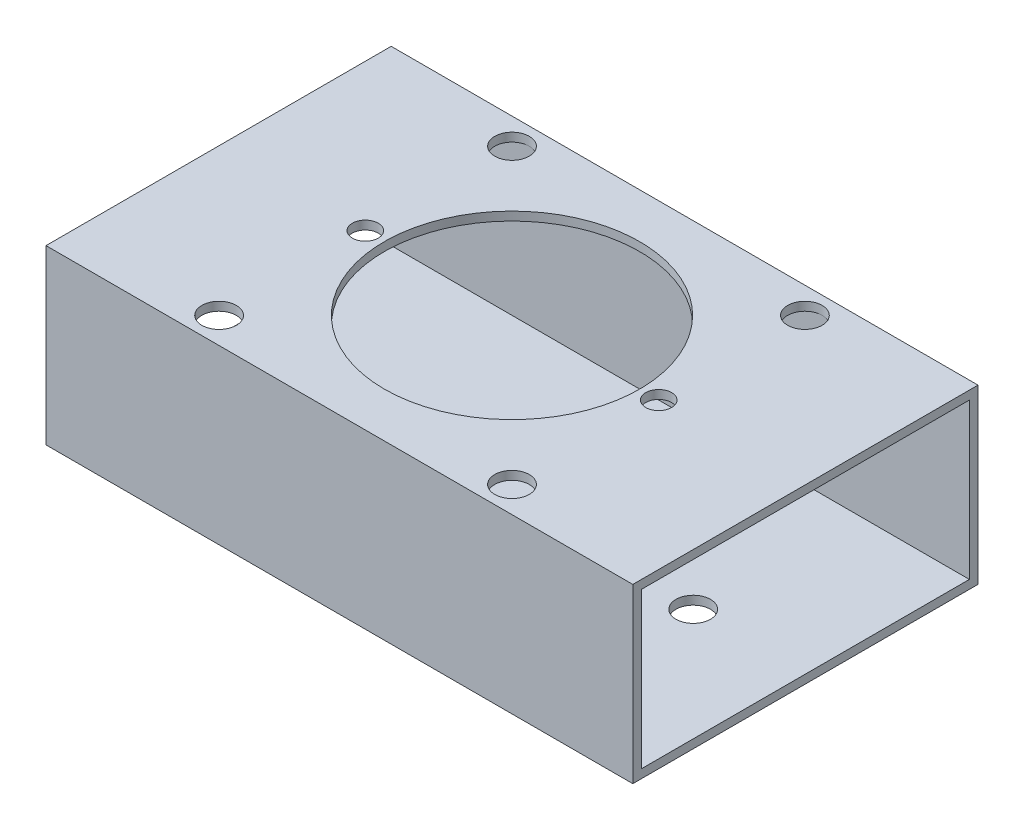
ISO-10303-21;
HEADER;
FILE_DESCRIPTION(('STEP AP214'),'2;1');
FILE_NAME('part.step','',(''),(''),'','','');
FILE_SCHEMA(('AUTOMOTIVE_DESIGN { 1 0 10303 214 1 1 1 1 }'));
ENDSEC;
DATA;
#1=APPLICATION_CONTEXT('core data for automotive mechanical design processes');
#2=APPLICATION_PROTOCOL_DEFINITION('international standard','automotive_design',2000,#1);
#3=PRODUCT_CONTEXT('',#1,'mechanical');
#4=PRODUCT('Part','Part','',(#3));
#5=PRODUCT_RELATED_PRODUCT_CATEGORY('part','',(#4));
#6=PRODUCT_DEFINITION_FORMATION('','',#4);
#7=PRODUCT_DEFINITION_CONTEXT('part definition',#1,'design');
#8=PRODUCT_DEFINITION('design','',#6,#7);
#9=PRODUCT_DEFINITION_SHAPE('','',#8);
#10=(LENGTH_UNIT() NAMED_UNIT(*) SI_UNIT(.MILLI.,.METRE.));
#11=(NAMED_UNIT(*) PLANE_ANGLE_UNIT() SI_UNIT($,.RADIAN.));
#12=(NAMED_UNIT(*) SI_UNIT($,.STERADIAN.) SOLID_ANGLE_UNIT());
#13=UNCERTAINTY_MEASURE_WITH_UNIT(LENGTH_MEASURE(1.E-05),#10,'distance_accuracy_value','');
#14=(GEOMETRIC_REPRESENTATION_CONTEXT(3) GLOBAL_UNCERTAINTY_ASSIGNED_CONTEXT((#13)) GLOBAL_UNIT_ASSIGNED_CONTEXT((#10,
#11,#12)) REPRESENTATION_CONTEXT('',''));
#15=CARTESIAN_POINT('',(0.,0.,0.));
#16=DIRECTION('',(0.,0.,1.));
#17=DIRECTION('',(1.,0.,0.));
#18=AXIS2_PLACEMENT_3D('',#15,#16,#17);
#19=CARTESIAN_POINT('',(-34.,20.,20.));
#20=DIRECTION('',(1.,0.,0.));
#21=DIRECTION('',(0.,0.,-1.));
#22=AXIS2_PLACEMENT_3D('',#19,#20,#21);
#23=PLANE('',#22);
#24=DIRECTION('',(0.,0.,-1.));
#25=VECTOR('',#24,1.);
#26=CARTESIAN_POINT('',(-34.,1.,19.));
#27=LINE('',#26,#25);
#28=CARTESIAN_POINT('',(-34.,1.,19.));
#29=VERTEX_POINT('',#28);
#30=CARTESIAN_POINT('',(-34.,1.,-19.));
#31=VERTEX_POINT('',#30);
#32=EDGE_CURVE('E109',#29,#31,#27,.T.);
#33=ORIENTED_EDGE('',*,*,#32,.T.);
#34=DIRECTION('',(0.,1.,0.));
#35=VECTOR('',#34,1.);
#36=CARTESIAN_POINT('',(-34.,1.,-19.));
#37=LINE('',#36,#35);
#38=CARTESIAN_POINT('',(-34.,19.,-19.));
#39=VERTEX_POINT('',#38);
#40=EDGE_CURVE('E103',#31,#39,#37,.T.);
#41=ORIENTED_EDGE('',*,*,#40,.T.);
#42=DIRECTION('',(0.,0.,1.));
#43=VECTOR('',#42,1.);
#44=CARTESIAN_POINT('',(-34.,19.,-19.));
#45=LINE('',#44,#43);
#46=CARTESIAN_POINT('',(-34.,19.,19.));
#47=VERTEX_POINT('',#46);
#48=EDGE_CURVE('E112',#39,#47,#45,.T.);
#49=ORIENTED_EDGE('',*,*,#48,.T.);
#50=DIRECTION('',(0.,-1.,0.));
#51=VECTOR('',#50,1.);
#52=CARTESIAN_POINT('',(-34.,19.,19.));
#53=LINE('',#52,#51);
#54=EDGE_CURVE('E51',#47,#29,#53,.T.);
#55=ORIENTED_EDGE('',*,*,#54,.T.);
#56=EDGE_LOOP('',(#33,#41,#49,#55));
#57=FACE_BOUND('',#56,.T.);
#58=DIRECTION('',(0.,0.,1.));
#59=VECTOR('',#58,1.);
#60=CARTESIAN_POINT('',(-34.,0.,20.));
#61=LINE('',#60,#59);
#62=CARTESIAN_POINT('',(-34.,0.,-20.));
#63=VERTEX_POINT('',#62);
#64=CARTESIAN_POINT('',(-34.,0.,20.));
#65=VERTEX_POINT('',#64);
#66=EDGE_CURVE('E137',#63,#65,#61,.T.);
#67=ORIENTED_EDGE('',*,*,#66,.T.);
#68=DIRECTION('',(0.,-1.,0.));
#69=VECTOR('',#68,1.);
#70=CARTESIAN_POINT('',(-34.,20.,20.));
#71=LINE('',#70,#69);
#72=CARTESIAN_POINT('',(-34.,20.,20.));
#73=VERTEX_POINT('',#72);
#74=EDGE_CURVE('E11',#73,#65,#71,.T.);
#75=ORIENTED_EDGE('',*,*,#74,.F.);
#76=DIRECTION('',(0.,0.,1.));
#77=VECTOR('',#76,1.);
#78=CARTESIAN_POINT('',(-34.,20.,20.));
#79=LINE('',#78,#77);
#80=CARTESIAN_POINT('',(-34.,20.,-20.));
#81=VERTEX_POINT('',#80);
#82=EDGE_CURVE('E141',#81,#73,#79,.T.);
#83=ORIENTED_EDGE('',*,*,#82,.F.);
#84=DIRECTION('',(0.,-1.,0.));
#85=VECTOR('',#84,1.);
#86=CARTESIAN_POINT('',(-34.,20.,-20.));
#87=LINE('',#86,#85);
#88=EDGE_CURVE('E151',#81,#63,#87,.T.);
#89=ORIENTED_EDGE('',*,*,#88,.T.);
#90=EDGE_LOOP('',(#67,#75,#83,#89));
#91=FACE_BOUND('',#90,.T.);
#92=ADVANCED_FACE('F37',(#57,#91),#23,.F.);
#93=CARTESIAN_POINT('',(-34.,20.,20.));
#94=DIRECTION('',(0.,0.,-1.));
#95=DIRECTION('',(-1.,0.,0.));
#96=AXIS2_PLACEMENT_3D('',#93,#94,#95);
#97=PLANE('',#96);
#98=DIRECTION('',(1.,0.,0.));
#99=VECTOR('',#98,1.);
#100=CARTESIAN_POINT('',(-34.,0.,20.));
#101=LINE('',#100,#99);
#102=CARTESIAN_POINT('',(34.,0.,20.));
#103=VERTEX_POINT('',#102);
#104=EDGE_CURVE('E154',#65,#103,#101,.T.);
#105=ORIENTED_EDGE('',*,*,#104,.T.);
#106=DIRECTION('',(0.,-1.,0.));
#107=VECTOR('',#106,1.);
#108=CARTESIAN_POINT('',(34.,20.,20.));
#109=LINE('',#108,#107);
#110=CARTESIAN_POINT('',(34.,20.,20.));
#111=VERTEX_POINT('',#110);
#112=EDGE_CURVE('E44',#111,#103,#109,.T.);
#113=ORIENTED_EDGE('',*,*,#112,.F.);
#114=DIRECTION('',(1.,0.,0.));
#115=VECTOR('',#114,1.);
#116=CARTESIAN_POINT('',(-34.,20.,20.));
#117=LINE('',#116,#115);
#118=EDGE_CURVE('E144',#73,#111,#117,.T.);
#119=ORIENTED_EDGE('',*,*,#118,.F.);
#120=ORIENTED_EDGE('',*,*,#74,.T.);
#121=EDGE_LOOP('',(#105,#113,#119,#120));
#122=FACE_BOUND('',#121,.T.);
#123=ADVANCED_FACE('F183',(#122),#97,.F.);
#124=CARTESIAN_POINT('',(34.,20.,20.));
#125=DIRECTION('',(-1.,0.,0.));
#126=DIRECTION('',(0.,0.,1.));
#127=AXIS2_PLACEMENT_3D('',#124,#125,#126);
#128=PLANE('',#127);
#129=DIRECTION('',(0.,0.,1.));
#130=VECTOR('',#129,1.);
#131=CARTESIAN_POINT('',(34.,19.,-19.));
#132=LINE('',#131,#130);
#133=CARTESIAN_POINT('',(34.,19.,-19.));
#134=VERTEX_POINT('',#133);
#135=CARTESIAN_POINT('',(34.,19.,19.));
#136=VERTEX_POINT('',#135);
#137=EDGE_CURVE('E130',#134,#136,#132,.T.);
#138=ORIENTED_EDGE('',*,*,#137,.F.);
#139=DIRECTION('',(0.,1.,0.));
#140=VECTOR('',#139,1.);
#141=CARTESIAN_POINT('',(34.,1.,-19.));
#142=LINE('',#141,#140);
#143=CARTESIAN_POINT('',(34.,1.,-19.));
#144=VERTEX_POINT('',#143);
#145=EDGE_CURVE('E59',#144,#134,#142,.T.);
#146=ORIENTED_EDGE('',*,*,#145,.F.);
#147=DIRECTION('',(0.,0.,-1.));
#148=VECTOR('',#147,1.);
#149=CARTESIAN_POINT('',(34.,1.,19.));
#150=LINE('',#149,#148);
#151=CARTESIAN_POINT('',(34.,1.,19.));
#152=VERTEX_POINT('',#151);
#153=EDGE_CURVE('E118',#152,#144,#150,.T.);
#154=ORIENTED_EDGE('',*,*,#153,.F.);
#155=DIRECTION('',(0.,-1.,0.));
#156=VECTOR('',#155,1.);
#157=CARTESIAN_POINT('',(34.,19.,19.));
#158=LINE('',#157,#156);
#159=EDGE_CURVE('E121',#136,#152,#158,.T.);
#160=ORIENTED_EDGE('',*,*,#159,.F.);
#161=EDGE_LOOP('',(#138,#146,#154,#160));
#162=FACE_BOUND('',#161,.T.);
#163=DIRECTION('',(0.,0.,-1.));
#164=VECTOR('',#163,1.);
#165=CARTESIAN_POINT('',(34.,0.,20.));
#166=LINE('',#165,#164);
#167=CARTESIAN_POINT('',(34.,0.,-20.));
#168=VERTEX_POINT('',#167);
#169=EDGE_CURVE('E156',#103,#168,#166,.T.);
#170=ORIENTED_EDGE('',*,*,#169,.T.);
#171=DIRECTION('',(0.,-1.,0.));
#172=VECTOR('',#171,1.);
#173=CARTESIAN_POINT('',(34.,20.,-20.));
#174=LINE('',#173,#172);
#175=CARTESIAN_POINT('',(34.,20.,-20.));
#176=VERTEX_POINT('',#175);
#177=EDGE_CURVE('E161',#176,#168,#174,.T.);
#178=ORIENTED_EDGE('',*,*,#177,.F.);
#179=DIRECTION('',(0.,0.,-1.));
#180=VECTOR('',#179,1.);
#181=CARTESIAN_POINT('',(34.,20.,20.));
#182=LINE('',#181,#180);
#183=EDGE_CURVE('E147',#111,#176,#182,.T.);
#184=ORIENTED_EDGE('',*,*,#183,.F.);
#185=ORIENTED_EDGE('',*,*,#112,.T.);
#186=EDGE_LOOP('',(#170,#178,#184,#185));
#187=FACE_BOUND('',#186,.T.);
#188=ADVANCED_FACE('F168',(#162,#187),#128,.F.);
#189=CARTESIAN_POINT('',(-34.,20.,-20.));
#190=DIRECTION('',(0.,0.,1.));
#191=DIRECTION('',(1.,0.,0.));
#192=AXIS2_PLACEMENT_3D('',#189,#190,#191);
#193=PLANE('',#192);
#194=DIRECTION('',(-1.,0.,0.));
#195=VECTOR('',#194,1.);
#196=CARTESIAN_POINT('',(-34.,0.,-20.));
#197=LINE('',#196,#195);
#198=EDGE_CURVE('E145',#168,#63,#197,.T.);
#199=ORIENTED_EDGE('',*,*,#198,.T.);
#200=ORIENTED_EDGE('',*,*,#88,.F.);
#201=DIRECTION('',(-1.,0.,0.));
#202=VECTOR('',#201,1.);
#203=CARTESIAN_POINT('',(-34.,20.,-20.));
#204=LINE('',#203,#202);
#205=EDGE_CURVE('E149',#176,#81,#204,.T.);
#206=ORIENTED_EDGE('',*,*,#205,.F.);
#207=ORIENTED_EDGE('',*,*,#177,.T.);
#208=EDGE_LOOP('',(#199,#200,#206,#207));
#209=FACE_BOUND('',#208,.T.);
#210=ADVANCED_FACE('F177',(#209),#193,.F.);
#211=CARTESIAN_POINT('',(0.,20.,0.));
#212=DIRECTION('',(0.,-1.,0.));
#213=DIRECTION('',(0.,0.,-1.));
#214=AXIS2_PLACEMENT_3D('',#211,#212,#213);
#215=PLANE('',#214);
#216=CARTESIAN_POINT('',(16.9705627484771,20.,16.9705627484771));
#217=DIRECTION('',(0.,1.,0.));
#218=DIRECTION('',(0.,0.,1.));
#219=AXIS2_PLACEMENT_3D('',#216,#217,#218);
#220=CIRCLE('',#219,1.99999999999999);
#221=CARTESIAN_POINT('',(16.9705627484771,20.,18.9705627484771));
#222=VERTEX_POINT('',#221);
#223=EDGE_CURVE('E255',#222,#222,#220,.T.);
#224=ORIENTED_EDGE('',*,*,#223,.F.);
#225=EDGE_LOOP('',(#224));
#226=FACE_BOUND('',#225,.T.);
#227=CARTESIAN_POINT('',(-16.9705627484771,20.,16.9705627484771));
#228=DIRECTION('',(0.,1.,0.));
#229=DIRECTION('',(0.,0.,1.));
#230=AXIS2_PLACEMENT_3D('',#227,#228,#229);
#231=CIRCLE('',#230,1.99999999999999);
#232=CARTESIAN_POINT('',(-16.9705627484771,20.,18.9705627484771));
#233=VERTEX_POINT('',#232);
#234=EDGE_CURVE('E257',#233,#233,#231,.T.);
#235=ORIENTED_EDGE('',*,*,#234,.F.);
#236=EDGE_LOOP('',(#235));
#237=FACE_BOUND('',#236,.T.);
#238=CARTESIAN_POINT('',(-16.9705627484771,20.,-16.9705627484771));
#239=DIRECTION('',(0.,1.,0.));
#240=DIRECTION('',(0.,0.,1.));
#241=AXIS2_PLACEMENT_3D('',#238,#239,#240);
#242=CIRCLE('',#241,1.99999999999999);
#243=CARTESIAN_POINT('',(-16.9705627484771,20.,-14.9705627484771));
#244=VERTEX_POINT('',#243);
#245=EDGE_CURVE('E265',#244,#244,#242,.T.);
#246=ORIENTED_EDGE('',*,*,#245,.F.);
#247=EDGE_LOOP('',(#246));
#248=FACE_BOUND('',#247,.T.);
#249=CARTESIAN_POINT('',(16.9705627484771,20.,-16.9705627484771));
#250=DIRECTION('',(0.,1.,0.));
#251=DIRECTION('',(0.,0.,1.));
#252=AXIS2_PLACEMENT_3D('',#249,#250,#251);
#253=CIRCLE('',#252,1.99999999999999);
#254=CARTESIAN_POINT('',(16.9705627484771,20.,-14.9705627484771));
#255=VERTEX_POINT('',#254);
#256=EDGE_CURVE('E271',#255,#255,#253,.T.);
#257=ORIENTED_EDGE('',*,*,#256,.F.);
#258=EDGE_LOOP('',(#257));
#259=FACE_BOUND('',#258,.T.);
#260=CARTESIAN_POINT('',(17.,20.,0.));
#261=DIRECTION('',(0.,1.,0.));
#262=DIRECTION('',(0.,0.,1.));
#263=AXIS2_PLACEMENT_3D('',#260,#261,#262);
#264=CIRCLE('',#263,1.5);
#265=CARTESIAN_POINT('',(17.,20.,1.5));
#266=VERTEX_POINT('',#265);
#267=EDGE_CURVE('E285',#266,#266,#264,.T.);
#268=ORIENTED_EDGE('',*,*,#267,.F.);
#269=EDGE_LOOP('',(#268));
#270=FACE_BOUND('',#269,.T.);
#271=CARTESIAN_POINT('',(-17.,20.,0.));
#272=DIRECTION('',(0.,1.,0.));
#273=DIRECTION('',(0.,0.,1.));
#274=AXIS2_PLACEMENT_3D('',#271,#272,#273);
#275=CIRCLE('',#274,1.5);
#276=CARTESIAN_POINT('',(-17.,20.,1.5));
#277=VERTEX_POINT('',#276);
#278=EDGE_CURVE('E278',#277,#277,#275,.T.);
#279=ORIENTED_EDGE('',*,*,#278,.F.);
#280=EDGE_LOOP('',(#279));
#281=FACE_BOUND('',#280,.T.);
#282=CARTESIAN_POINT('',(0.,20.,0.));
#283=DIRECTION('',(0.,1.,0.));
#284=DIRECTION('',(0.,0.,1.));
#285=AXIS2_PLACEMENT_3D('',#282,#283,#284);
#286=CIRCLE('',#285,14.8);
#287=CARTESIAN_POINT('',(0.,20.,14.8));
#288=VERTEX_POINT('',#287);
#289=EDGE_CURVE('E281',#288,#288,#286,.T.);
#290=ORIENTED_EDGE('',*,*,#289,.F.);
#291=EDGE_LOOP('',(#290));
#292=FACE_BOUND('',#291,.T.);
#293=ORIENTED_EDGE('',*,*,#82,.T.);
#294=ORIENTED_EDGE('',*,*,#118,.T.);
#295=ORIENTED_EDGE('',*,*,#183,.T.);
#296=ORIENTED_EDGE('',*,*,#205,.T.);
#297=EDGE_LOOP('',(#293,#294,#295,#296));
#298=FACE_BOUND('',#297,.T.);
#299=ADVANCED_FACE('F182',(#226,#237,#248,#259,#270,#281,#292,#298),#215,.F.);
#300=CARTESIAN_POINT('',(0.,0.,0.));
#301=DIRECTION('',(0.,-1.,0.));
#302=DIRECTION('',(0.,0.,-1.));
#303=AXIS2_PLACEMENT_3D('',#300,#301,#302);
#304=PLANE('',#303);
#305=CARTESIAN_POINT('',(-21.,0.,0.));
#306=DIRECTION('',(0.,-1.,0.));
#307=DIRECTION('',(0.,0.,-1.));
#308=AXIS2_PLACEMENT_3D('',#305,#306,#307);
#309=CIRCLE('',#308,2.);
#310=CARTESIAN_POINT('',(-21.,0.,-2.));
#311=VERTEX_POINT('',#310);
#312=EDGE_CURVE('E297',#311,#311,#309,.T.);
#313=ORIENTED_EDGE('',*,*,#312,.F.);
#314=EDGE_LOOP('',(#313));
#315=FACE_BOUND('',#314,.T.);
#316=CARTESIAN_POINT('',(21.,0.,0.));
#317=DIRECTION('',(0.,-1.,0.));
#318=DIRECTION('',(0.,0.,-1.));
#319=AXIS2_PLACEMENT_3D('',#316,#317,#318);
#320=CIRCLE('',#319,2.);
#321=CARTESIAN_POINT('',(21.,0.,-2.));
#322=VERTEX_POINT('',#321);
#323=EDGE_CURVE('E299',#322,#322,#320,.T.);
#324=ORIENTED_EDGE('',*,*,#323,.F.);
#325=EDGE_LOOP('',(#324));
#326=FACE_BOUND('',#325,.T.);
#327=ORIENTED_EDGE('',*,*,#66,.F.);
#328=ORIENTED_EDGE('',*,*,#198,.F.);
#329=ORIENTED_EDGE('',*,*,#169,.F.);
#330=ORIENTED_EDGE('',*,*,#104,.F.);
#331=EDGE_LOOP('',(#327,#328,#329,#330));
#332=FACE_BOUND('',#331,.T.);
#333=ADVANCED_FACE('F174',(#315,#326,#332),#304,.T.);
#334=CARTESIAN_POINT('',(-34.,1.,-19.));
#335=DIRECTION('',(0.,0.,-1.));
#336=DIRECTION('',(-1.,0.,0.));
#337=AXIS2_PLACEMENT_3D('',#334,#335,#336);
#338=PLANE('',#337);
#339=ORIENTED_EDGE('',*,*,#145,.T.);
#340=DIRECTION('',(1.,0.,0.));
#341=VECTOR('',#340,1.);
#342=CARTESIAN_POINT('',(-34.,19.,-19.));
#343=LINE('',#342,#341);
#344=EDGE_CURVE('E99',#39,#134,#343,.T.);
#345=ORIENTED_EDGE('',*,*,#344,.F.);
#346=ORIENTED_EDGE('',*,*,#40,.F.);
#347=DIRECTION('',(1.,0.,0.));
#348=VECTOR('',#347,1.);
#349=CARTESIAN_POINT('',(-34.,1.,-19.));
#350=LINE('',#349,#348);
#351=EDGE_CURVE('E135',#31,#144,#350,.T.);
#352=ORIENTED_EDGE('',*,*,#351,.T.);
#353=EDGE_LOOP('',(#339,#345,#346,#352));
#354=FACE_BOUND('',#353,.T.);
#355=ADVANCED_FACE('F101',(#354),#338,.F.);
#356=CARTESIAN_POINT('',(-34.,1.,19.));
#357=DIRECTION('',(0.,-1.,0.));
#358=DIRECTION('',(0.,0.,-1.));
#359=AXIS2_PLACEMENT_3D('',#356,#357,#358);
#360=PLANE('',#359);
#361=CARTESIAN_POINT('',(-21.,1.,0.));
#362=DIRECTION('',(0.,-1.,0.));
#363=DIRECTION('',(0.,0.,-1.));
#364=AXIS2_PLACEMENT_3D('',#361,#362,#363);
#365=CIRCLE('',#364,2.);
#366=CARTESIAN_POINT('',(-21.,1.,-2.));
#367=VERTEX_POINT('',#366);
#368=EDGE_CURVE('E131',#367,#367,#365,.T.);
#369=ORIENTED_EDGE('',*,*,#368,.T.);
#370=EDGE_LOOP('',(#369));
#371=FACE_BOUND('',#370,.T.);
#372=CARTESIAN_POINT('',(21.,1.,0.));
#373=DIRECTION('',(0.,-1.,0.));
#374=DIRECTION('',(0.,0.,-1.));
#375=AXIS2_PLACEMENT_3D('',#372,#373,#374);
#376=CIRCLE('',#375,2.);
#377=CARTESIAN_POINT('',(21.,1.,-2.));
#378=VERTEX_POINT('',#377);
#379=EDGE_CURVE('E124',#378,#378,#376,.T.);
#380=ORIENTED_EDGE('',*,*,#379,.T.);
#381=EDGE_LOOP('',(#380));
#382=FACE_BOUND('',#381,.T.);
#383=ORIENTED_EDGE('',*,*,#153,.T.);
#384=ORIENTED_EDGE('',*,*,#351,.F.);
#385=ORIENTED_EDGE('',*,*,#32,.F.);
#386=DIRECTION('',(1.,0.,0.));
#387=VECTOR('',#386,1.);
#388=CARTESIAN_POINT('',(-34.,1.,19.));
#389=LINE('',#388,#387);
#390=EDGE_CURVE('E138',#29,#152,#389,.T.);
#391=ORIENTED_EDGE('',*,*,#390,.T.);
#392=EDGE_LOOP('',(#383,#384,#385,#391));
#393=FACE_BOUND('',#392,.T.);
#394=ADVANCED_FACE('F202',(#371,#382,#393),#360,.F.);
#395=CARTESIAN_POINT('',(-34.,19.,19.));
#396=DIRECTION('',(0.,0.,1.));
#397=DIRECTION('',(1.,0.,0.));
#398=AXIS2_PLACEMENT_3D('',#395,#396,#397);
#399=PLANE('',#398);
#400=ORIENTED_EDGE('',*,*,#159,.T.);
#401=ORIENTED_EDGE('',*,*,#390,.F.);
#402=ORIENTED_EDGE('',*,*,#54,.F.);
#403=DIRECTION('',(1.,0.,0.));
#404=VECTOR('',#403,1.);
#405=CARTESIAN_POINT('',(-34.,19.,19.));
#406=LINE('',#405,#404);
#407=EDGE_CURVE('E108',#47,#136,#406,.T.);
#408=ORIENTED_EDGE('',*,*,#407,.T.);
#409=EDGE_LOOP('',(#400,#401,#402,#408));
#410=FACE_BOUND('',#409,.T.);
#411=ADVANCED_FACE('F206',(#410),#399,.F.);
#412=CARTESIAN_POINT('',(-34.,19.,-19.));
#413=DIRECTION('',(0.,1.,0.));
#414=DIRECTION('',(0.,0.,1.));
#415=AXIS2_PLACEMENT_3D('',#412,#413,#414);
#416=PLANE('',#415);
#417=CARTESIAN_POINT('',(16.9705627484771,19.,16.9705627484771));
#418=DIRECTION('',(0.,1.,0.));
#419=DIRECTION('',(0.,0.,1.));
#420=AXIS2_PLACEMENT_3D('',#417,#418,#419);
#421=CIRCLE('',#420,2.);
#422=CARTESIAN_POINT('',(16.9705627484771,19.,18.9705627484771));
#423=VERTEX_POINT('',#422);
#424=EDGE_CURVE('E252',#423,#423,#421,.T.);
#425=ORIENTED_EDGE('',*,*,#424,.T.);
#426=EDGE_LOOP('',(#425));
#427=FACE_BOUND('',#426,.T.);
#428=CARTESIAN_POINT('',(-16.9705627484771,19.,16.9705627484771));
#429=DIRECTION('',(0.,1.,0.));
#430=DIRECTION('',(0.,0.,1.));
#431=AXIS2_PLACEMENT_3D('',#428,#429,#430);
#432=CIRCLE('',#431,2.);
#433=CARTESIAN_POINT('',(-16.9705627484771,19.,18.9705627484772));
#434=VERTEX_POINT('',#433);
#435=EDGE_CURVE('E262',#434,#434,#432,.T.);
#436=ORIENTED_EDGE('',*,*,#435,.T.);
#437=EDGE_LOOP('',(#436));
#438=FACE_BOUND('',#437,.T.);
#439=CARTESIAN_POINT('',(-16.9705627484771,19.,-16.9705627484771));
#440=DIRECTION('',(0.,1.,0.));
#441=DIRECTION('',(0.,0.,1.));
#442=AXIS2_PLACEMENT_3D('',#439,#440,#441);
#443=CIRCLE('',#442,2.);
#444=CARTESIAN_POINT('',(-16.9705627484771,19.,-14.9705627484771));
#445=VERTEX_POINT('',#444);
#446=EDGE_CURVE('E268',#445,#445,#443,.T.);
#447=ORIENTED_EDGE('',*,*,#446,.T.);
#448=EDGE_LOOP('',(#447));
#449=FACE_BOUND('',#448,.T.);
#450=CARTESIAN_POINT('',(16.9705627484771,19.,-16.9705627484771));
#451=DIRECTION('',(0.,1.,0.));
#452=DIRECTION('',(0.,0.,1.));
#453=AXIS2_PLACEMENT_3D('',#450,#451,#452);
#454=CIRCLE('',#453,2.);
#455=CARTESIAN_POINT('',(16.9705627484771,19.,-14.9705627484771));
#456=VERTEX_POINT('',#455);
#457=EDGE_CURVE('E274',#456,#456,#454,.T.);
#458=ORIENTED_EDGE('',*,*,#457,.T.);
#459=EDGE_LOOP('',(#458));
#460=FACE_BOUND('',#459,.T.);
#461=CARTESIAN_POINT('',(17.,19.,0.));
#462=DIRECTION('',(0.,1.,0.));
#463=DIRECTION('',(0.,0.,1.));
#464=AXIS2_PLACEMENT_3D('',#461,#462,#463);
#465=CIRCLE('',#464,1.5);
#466=CARTESIAN_POINT('',(17.,19.,1.5));
#467=VERTEX_POINT('',#466);
#468=EDGE_CURVE('E277',#467,#467,#465,.T.);
#469=ORIENTED_EDGE('',*,*,#468,.T.);
#470=EDGE_LOOP('',(#469));
#471=FACE_BOUND('',#470,.T.);
#472=CARTESIAN_POINT('',(-17.,19.,0.));
#473=DIRECTION('',(0.,1.,0.));
#474=DIRECTION('',(0.,0.,1.));
#475=AXIS2_PLACEMENT_3D('',#472,#473,#474);
#476=CIRCLE('',#475,1.5);
#477=CARTESIAN_POINT('',(-17.,19.,1.5));
#478=VERTEX_POINT('',#477);
#479=EDGE_CURVE('E282',#478,#478,#476,.T.);
#480=ORIENTED_EDGE('',*,*,#479,.T.);
#481=EDGE_LOOP('',(#480));
#482=FACE_BOUND('',#481,.T.);
#483=CARTESIAN_POINT('',(0.,19.,0.));
#484=DIRECTION('',(0.,1.,0.));
#485=DIRECTION('',(0.,0.,1.));
#486=AXIS2_PLACEMENT_3D('',#483,#484,#485);
#487=CIRCLE('',#486,14.8);
#488=CARTESIAN_POINT('',(0.,19.,14.8));
#489=VERTEX_POINT('',#488);
#490=EDGE_CURVE('E290',#489,#489,#487,.T.);
#491=ORIENTED_EDGE('',*,*,#490,.T.);
#492=EDGE_LOOP('',(#491));
#493=FACE_BOUND('',#492,.T.);
#494=ORIENTED_EDGE('',*,*,#137,.T.);
#495=ORIENTED_EDGE('',*,*,#407,.F.);
#496=ORIENTED_EDGE('',*,*,#48,.F.);
#497=ORIENTED_EDGE('',*,*,#344,.T.);
#498=EDGE_LOOP('',(#494,#495,#496,#497));
#499=FACE_BOUND('',#498,.T.);
#500=ADVANCED_FACE('F113',(#427,#438,#449,#460,#471,#482,#493,#499),#416,.F.);
#501=CARTESIAN_POINT('',(21.,1.,0.));
#502=DIRECTION('',(0.,-1.,0.));
#503=DIRECTION('',(0.,0.,-1.));
#504=AXIS2_PLACEMENT_3D('',#501,#502,#503);
#505=CYLINDRICAL_SURFACE('',#504,2.);
#506=ORIENTED_EDGE('',*,*,#379,.F.);
#507=EDGE_LOOP('',(#506));
#508=FACE_BOUND('',#507,.T.);
#509=ORIENTED_EDGE('',*,*,#323,.T.);
#510=EDGE_LOOP('',(#509));
#511=FACE_BOUND('',#510,.T.);
#512=ADVANCED_FACE('F205',(#508,#511),#505,.F.);
#513=CARTESIAN_POINT('',(-21.,1.,0.));
#514=DIRECTION('',(0.,-1.,0.));
#515=DIRECTION('',(0.,0.,-1.));
#516=AXIS2_PLACEMENT_3D('',#513,#514,#515);
#517=CYLINDRICAL_SURFACE('',#516,2.);
#518=ORIENTED_EDGE('',*,*,#368,.F.);
#519=EDGE_LOOP('',(#518));
#520=FACE_BOUND('',#519,.T.);
#521=ORIENTED_EDGE('',*,*,#312,.T.);
#522=EDGE_LOOP('',(#521));
#523=FACE_BOUND('',#522,.T.);
#524=ADVANCED_FACE('F215',(#520,#523),#517,.F.);
#525=CARTESIAN_POINT('',(0.,19.,0.));
#526=DIRECTION('',(0.,1.,0.));
#527=DIRECTION('',(0.,0.,1.));
#528=AXIS2_PLACEMENT_3D('',#525,#526,#527);
#529=CYLINDRICAL_SURFACE('',#528,14.8);
#530=ORIENTED_EDGE('',*,*,#490,.F.);
#531=EDGE_LOOP('',(#530));
#532=FACE_BOUND('',#531,.T.);
#533=ORIENTED_EDGE('',*,*,#289,.T.);
#534=EDGE_LOOP('',(#533));
#535=FACE_BOUND('',#534,.T.);
#536=ADVANCED_FACE('F219',(#532,#535),#529,.F.);
#537=CARTESIAN_POINT('',(-17.,19.,0.));
#538=DIRECTION('',(0.,1.,0.));
#539=DIRECTION('',(0.,0.,1.));
#540=AXIS2_PLACEMENT_3D('',#537,#538,#539);
#541=CYLINDRICAL_SURFACE('',#540,1.5);
#542=ORIENTED_EDGE('',*,*,#479,.F.);
#543=EDGE_LOOP('',(#542));
#544=FACE_BOUND('',#543,.T.);
#545=ORIENTED_EDGE('',*,*,#278,.T.);
#546=EDGE_LOOP('',(#545));
#547=FACE_BOUND('',#546,.T.);
#548=ADVANCED_FACE('F223',(#544,#547),#541,.F.);
#549=CARTESIAN_POINT('',(17.,19.,0.));
#550=DIRECTION('',(0.,1.,0.));
#551=DIRECTION('',(0.,0.,1.));
#552=AXIS2_PLACEMENT_3D('',#549,#550,#551);
#553=CYLINDRICAL_SURFACE('',#552,1.5);
#554=ORIENTED_EDGE('',*,*,#468,.F.);
#555=EDGE_LOOP('',(#554));
#556=FACE_BOUND('',#555,.T.);
#557=ORIENTED_EDGE('',*,*,#267,.T.);
#558=EDGE_LOOP('',(#557));
#559=FACE_BOUND('',#558,.T.);
#560=ADVANCED_FACE('F225',(#556,#559),#553,.F.);
#561=CARTESIAN_POINT('',(16.9705627484771,20.,-16.9705627484771));
#562=DIRECTION('',(0.,1.,0.));
#563=DIRECTION('',(0.,0.,1.));
#564=AXIS2_PLACEMENT_3D('',#561,#562,#563);
#565=CYLINDRICAL_SURFACE('',#564,1.99999999999999);
#566=ORIENTED_EDGE('',*,*,#457,.F.);
#567=EDGE_LOOP('',(#566));
#568=FACE_BOUND('',#567,.T.);
#569=ORIENTED_EDGE('',*,*,#256,.T.);
#570=EDGE_LOOP('',(#569));
#571=FACE_BOUND('',#570,.T.);
#572=ADVANCED_FACE('F228',(#568,#571),#565,.F.);
#573=CARTESIAN_POINT('',(-16.9705627484771,20.,-16.9705627484771));
#574=DIRECTION('',(0.,1.,0.));
#575=DIRECTION('',(0.,0.,1.));
#576=AXIS2_PLACEMENT_3D('',#573,#574,#575);
#577=CYLINDRICAL_SURFACE('',#576,1.99999999999999);
#578=ORIENTED_EDGE('',*,*,#446,.F.);
#579=EDGE_LOOP('',(#578));
#580=FACE_BOUND('',#579,.T.);
#581=ORIENTED_EDGE('',*,*,#245,.T.);
#582=EDGE_LOOP('',(#581));
#583=FACE_BOUND('',#582,.T.);
#584=ADVANCED_FACE('F235',(#580,#583),#577,.F.);
#585=CARTESIAN_POINT('',(-16.9705627484771,20.,16.9705627484771));
#586=DIRECTION('',(0.,1.,0.));
#587=DIRECTION('',(0.,0.,1.));
#588=AXIS2_PLACEMENT_3D('',#585,#586,#587);
#589=CYLINDRICAL_SURFACE('',#588,1.99999999999999);
#590=ORIENTED_EDGE('',*,*,#435,.F.);
#591=EDGE_LOOP('',(#590));
#592=FACE_BOUND('',#591,.T.);
#593=ORIENTED_EDGE('',*,*,#234,.T.);
#594=EDGE_LOOP('',(#593));
#595=FACE_BOUND('',#594,.T.);
#596=ADVANCED_FACE('F239',(#592,#595),#589,.F.);
#597=CARTESIAN_POINT('',(16.9705627484771,20.,16.9705627484771));
#598=DIRECTION('',(0.,1.,0.));
#599=DIRECTION('',(0.,0.,1.));
#600=AXIS2_PLACEMENT_3D('',#597,#598,#599);
#601=CYLINDRICAL_SURFACE('',#600,1.99999999999999);
#602=ORIENTED_EDGE('',*,*,#424,.F.);
#603=EDGE_LOOP('',(#602));
#604=FACE_BOUND('',#603,.T.);
#605=ORIENTED_EDGE('',*,*,#223,.T.);
#606=EDGE_LOOP('',(#605));
#607=FACE_BOUND('',#606,.T.);
#608=ADVANCED_FACE('F243',(#604,#607),#601,.F.);
#609=CLOSED_SHELL('',(#92,#123,#188,#210,#299,#333,#355,#394,#411,#500,#512,#524,#536,#548,#560,
#572,#584,#596,#608));
#610=MANIFOLD_SOLID_BREP('B2',#609);
#611=ADVANCED_BREP_SHAPE_REPRESENTATION('',(#18,#610),#14);
#612=SHAPE_DEFINITION_REPRESENTATION(#9,#611);
ENDSEC;
END-ISO-10303-21;
